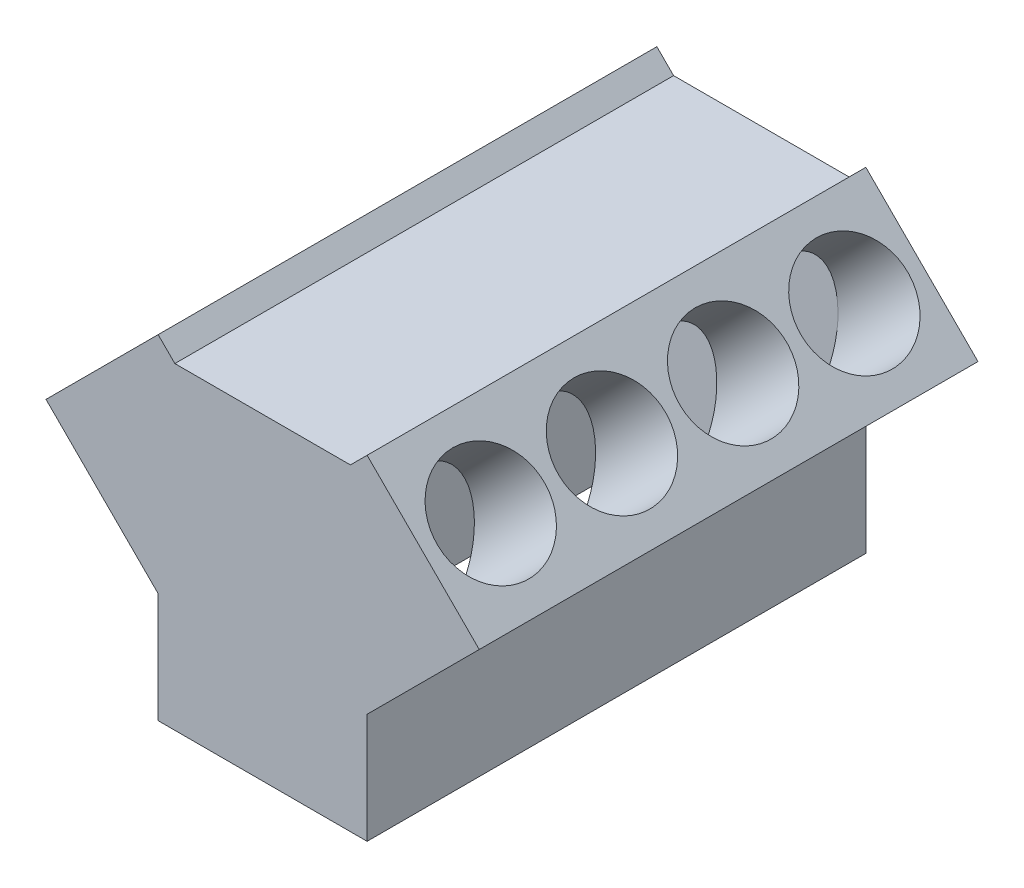
ISO-10303-21;
HEADER;
FILE_DESCRIPTION(('STEP AP214'),'2;1');
FILE_NAME('part.step','',(''),(''),'','','');
FILE_SCHEMA(('AUTOMOTIVE_DESIGN { 1 0 10303 214 1 1 1 1 }'));
ENDSEC;
DATA;
#1=APPLICATION_CONTEXT('core data for automotive mechanical design processes');
#2=APPLICATION_PROTOCOL_DEFINITION('international standard','automotive_design',2000,#1);
#3=PRODUCT_CONTEXT('',#1,'mechanical');
#4=PRODUCT('Part','Part','',(#3));
#5=PRODUCT_RELATED_PRODUCT_CATEGORY('part','',(#4));
#6=PRODUCT_DEFINITION_FORMATION('','',#4);
#7=PRODUCT_DEFINITION_CONTEXT('part definition',#1,'design');
#8=PRODUCT_DEFINITION('design','',#6,#7);
#9=PRODUCT_DEFINITION_SHAPE('','',#8);
#10=(LENGTH_UNIT() NAMED_UNIT(*) SI_UNIT(.MILLI.,.METRE.));
#11=(NAMED_UNIT(*) PLANE_ANGLE_UNIT() SI_UNIT($,.RADIAN.));
#12=(NAMED_UNIT(*) SI_UNIT($,.STERADIAN.) SOLID_ANGLE_UNIT());
#13=UNCERTAINTY_MEASURE_WITH_UNIT(LENGTH_MEASURE(1.E-05),#10,'distance_accuracy_value','');
#14=(GEOMETRIC_REPRESENTATION_CONTEXT(3) GLOBAL_UNCERTAINTY_ASSIGNED_CONTEXT((#13)) GLOBAL_UNIT_ASSIGNED_CONTEXT((#10,
#11,#12)) REPRESENTATION_CONTEXT('',''));
#15=CARTESIAN_POINT('',(0.,0.,0.));
#16=DIRECTION('',(0.,0.,1.));
#17=DIRECTION('',(1.,0.,0.));
#18=AXIS2_PLACEMENT_3D('',#15,#16,#17);
#19=CARTESIAN_POINT('',(0.,-150.,0.));
#20=DIRECTION('',(0.,-1.,0.));
#21=DIRECTION('',(0.,0.,-1.));
#22=AXIS2_PLACEMENT_3D('',#19,#20,#21);
#23=PLANE('',#22);
#24=DIRECTION('',(1.,0.,0.));
#25=VECTOR('',#24,1.);
#26=CARTESIAN_POINT('',(28.,-150.,-179.));
#27=LINE('',#26,#25);
#28=CARTESIAN_POINT('',(28.,-150.,-179.));
#29=VERTEX_POINT('',#28);
#30=CARTESIAN_POINT('',(178.,-150.,-179.));
#31=VERTEX_POINT('',#30);
#32=EDGE_CURVE('E267',#29,#31,#27,.T.);
#33=ORIENTED_EDGE('',*,*,#32,.T.);
#34=DIRECTION('',(0.,0.,1.));
#35=VECTOR('',#34,1.);
#36=CARTESIAN_POINT('',(178.,-150.,-179.));
#37=LINE('',#36,#35);
#38=CARTESIAN_POINT('',(178.,-150.,179.));
#39=VERTEX_POINT('',#38);
#40=EDGE_CURVE('E270',#31,#39,#37,.T.);
#41=ORIENTED_EDGE('',*,*,#40,.T.);
#42=DIRECTION('',(1.,0.,0.));
#43=VECTOR('',#42,1.);
#44=CARTESIAN_POINT('',(28.,-150.,179.));
#45=LINE('',#44,#43);
#46=CARTESIAN_POINT('',(28.,-150.,179.));
#47=VERTEX_POINT('',#46);
#48=EDGE_CURVE('E272',#47,#39,#45,.T.);
#49=ORIENTED_EDGE('',*,*,#48,.F.);
#50=DIRECTION('',(0.,0.,1.));
#51=VECTOR('',#50,1.);
#52=CARTESIAN_POINT('',(28.,-150.,-179.));
#53=LINE('',#52,#51);
#54=EDGE_CURVE('E275',#29,#47,#53,.T.);
#55=ORIENTED_EDGE('',*,*,#54,.F.);
#56=EDGE_LOOP('',(#33,#41,#49,#55));
#57=FACE_BOUND('',#56,.T.);
#58=DIRECTION('',(-1.,0.,0.));
#59=VECTOR('',#58,1.);
#60=CARTESIAN_POINT('',(0.,-150.,-169.));
#61=LINE('',#60,#59);
#62=CARTESIAN_POINT('',(168.,-150.,-169.));
#63=VERTEX_POINT('',#62);
#64=CARTESIAN_POINT('',(38.,-150.,-169.));
#65=VERTEX_POINT('',#64);
#66=EDGE_CURVE('E204',#63,#65,#61,.T.);
#67=ORIENTED_EDGE('',*,*,#66,.T.);
#68=DIRECTION('',(0.,0.,1.));
#69=VECTOR('',#68,1.);
#70=CARTESIAN_POINT('',(38.,-150.,0.));
#71=LINE('',#70,#69);
#72=CARTESIAN_POINT('',(38.,-150.,169.));
#73=VERTEX_POINT('',#72);
#74=EDGE_CURVE('E67',#65,#73,#71,.T.);
#75=ORIENTED_EDGE('',*,*,#74,.T.);
#76=DIRECTION('',(-1.,0.,0.));
#77=VECTOR('',#76,1.);
#78=CARTESIAN_POINT('',(0.,-150.,169.));
#79=LINE('',#78,#77);
#80=CARTESIAN_POINT('',(168.,-150.,169.));
#81=VERTEX_POINT('',#80);
#82=EDGE_CURVE('E195',#81,#73,#79,.T.);
#83=ORIENTED_EDGE('',*,*,#82,.F.);
#84=DIRECTION('',(0.,0.,1.));
#85=VECTOR('',#84,1.);
#86=CARTESIAN_POINT('',(168.,-150.,0.));
#87=LINE('',#86,#85);
#88=EDGE_CURVE('E198',#63,#81,#87,.T.);
#89=ORIENTED_EDGE('',*,*,#88,.F.);
#90=EDGE_LOOP('',(#67,#75,#83,#89));
#91=FACE_BOUND('',#90,.T.);
#92=ADVANCED_FACE('F50',(#57,#91),#23,.T.);
#93=CARTESIAN_POINT('',(69.0672798364513,-31.5672798364546,-130.637230843016));
#94=DIRECTION('',(-0.707106781186548,0.707106781186547,0.));
#95=DIRECTION('',(-0.707106781186547,-0.707106781186548,0.));
#96=AXIS2_PLACEMENT_3D('',#93,#94,#95);
#97=CYLINDRICAL_SURFACE('',#96,38.5);
#98=CARTESIAN_POINT('',(-12.2500000000017,49.7499999999984,-130.637230843016));
#99=DIRECTION('',(-0.707106781186548,0.707106781186547,0.));
#100=DIRECTION('',(-0.707106781186547,-0.707106781186548,0.));
#101=AXIS2_PLACEMENT_3D('',#98,#99,#100);
#102=CIRCLE('',#101,38.5);
#103=CARTESIAN_POINT('',(-39.4736110756838,22.5263889243163,-130.637230843016));
#104=VERTEX_POINT('',#103);
#105=EDGE_CURVE('E259',#104,#104,#102,.T.);
#106=ORIENTED_EDGE('',*,*,#105,.T.);
#107=EDGE_LOOP('',(#106));
#108=FACE_BOUND('',#107,.T.);
#109=DIRECTION('',(-0.707106781186548,0.707106781186547,0.));
#110=VECTOR('',#109,1.);
#111=CARTESIAN_POINT('',(71.3637926937989,-29.270766979107,-169.));
#112=LINE('',#111,#110);
#113=CARTESIAN_POINT('',(38.,4.09302571469193,-169.));
#114=VERTEX_POINT('',#113);
#115=CARTESIAN_POINT('',(71.3637926937989,-29.270766979107,-169.));
#116=VERTEX_POINT('',#115);
#117=EDGE_CURVE('E75',#114,#116,#112,.F.);
#118=ORIENTED_EDGE('',*,*,#117,.F.);
#119=CARTESIAN_POINT('',(38.,-0.500000000003258,-130.637230843016));
#120=DIRECTION('',(1.,0.,0.));
#121=DIRECTION('',(0.,1.,0.));
#122=AXIS2_PLACEMENT_3D('',#119,#120,#121);
#123=ELLIPSE('',#122,54.4472221513642,38.5);
#124=CARTESIAN_POINT('',(38.,-5.09302571469845,-169.));
#125=VERTEX_POINT('',#124);
#126=EDGE_CURVE('E187',#125,#114,#123,.F.);
#127=ORIENTED_EDGE('',*,*,#126,.F.);
#128=DIRECTION('',(-0.707106781186548,0.707106781186547,0.));
#129=VECTOR('',#128,1.);
#130=CARTESIAN_POINT('',(66.7707669791037,-33.8637926938022,-169.));
#131=LINE('',#130,#129);
#132=CARTESIAN_POINT('',(66.7707669791037,-33.8637926938022,-169.));
#133=VERTEX_POINT('',#132);
#134=EDGE_CURVE('E226',#133,#125,#131,.T.);
#135=ORIENTED_EDGE('',*,*,#134,.F.);
#136=CARTESIAN_POINT('',(69.0672798364513,-31.5672798364546,-130.637230843016));
#137=DIRECTION('',(-0.707106781186548,0.707106781186547,0.));
#138=DIRECTION('',(-0.707106781186547,-0.707106781186548,0.));
#139=AXIS2_PLACEMENT_3D('',#136,#137,#138);
#140=CIRCLE('',#139,38.5);
#141=EDGE_CURVE('E240',#116,#133,#140,.T.);
#142=ORIENTED_EDGE('',*,*,#141,.F.);
#143=EDGE_LOOP('',(#118,#127,#135,#142));
#144=FACE_BOUND('',#143,.T.);
#145=ADVANCED_FACE('F395',(#108,#144),#97,.F.);
#146=CARTESIAN_POINT('',(69.0672798364513,-31.5672798364546,-130.637230843016));
#147=DIRECTION('',(-0.707106781186548,0.707106781186547,0.));
#148=DIRECTION('',(-0.707106781186547,-0.707106781186548,0.));
#149=AXIS2_PLACEMENT_3D('',#146,#147,#148);
#150=PLANE('',#149);
#151=ORIENTED_EDGE('',*,*,#141,.T.);
#152=DIRECTION('',(0.707106781186547,0.707106781186548,0.));
#153=VECTOR('',#152,1.);
#154=CARTESIAN_POINT('',(69.0672798364513,-31.5672798364546,-169.));
#155=LINE('',#154,#153);
#156=EDGE_CURVE('E224',#133,#116,#155,.T.);
#157=ORIENTED_EDGE('',*,*,#156,.T.);
#158=EDGE_LOOP('',(#151,#157));
#159=FACE_BOUND('',#158,.T.);
#160=ADVANCED_FACE('F401',(#159),#150,.T.);
#161=CARTESIAN_POINT('',(69.0672798364517,-31.5672798364541,-43.6372308430156));
#162=DIRECTION('',(-0.707106781186548,0.707106781186547,0.));
#163=DIRECTION('',(-0.707106781186547,-0.707106781186548,0.));
#164=AXIS2_PLACEMENT_3D('',#161,#162,#163);
#165=CYLINDRICAL_SURFACE('',#164,38.5);
#166=CARTESIAN_POINT('',(-12.2500000000013,49.7499999999988,-43.6372308430156));
#167=DIRECTION('',(-0.707106781186548,0.707106781186547,0.));
#168=DIRECTION('',(-0.707106781186547,-0.707106781186548,0.));
#169=AXIS2_PLACEMENT_3D('',#166,#167,#168);
#170=CIRCLE('',#169,38.5);
#171=CARTESIAN_POINT('',(-39.4736110756833,22.5263889243167,-43.6372308430156));
#172=VERTEX_POINT('',#171);
#173=EDGE_CURVE('E256',#172,#172,#170,.T.);
#174=ORIENTED_EDGE('',*,*,#173,.T.);
#175=EDGE_LOOP('',(#174));
#176=FACE_BOUND('',#175,.T.);
#177=CARTESIAN_POINT('',(38.,-0.500000000002394,-43.6372308430156));
#178=DIRECTION('',(1.,0.,0.));
#179=DIRECTION('',(0.,1.,0.));
#180=AXIS2_PLACEMENT_3D('',#177,#178,#179);
#181=ELLIPSE('',#180,54.4472221513642,38.5);
#182=CARTESIAN_POINT('',(38.,53.9472221513618,-43.6372308430156));
#183=VERTEX_POINT('',#182);
#184=EDGE_CURVE('E232',#183,#183,#181,.F.);
#185=ORIENTED_EDGE('',*,*,#184,.F.);
#186=EDGE_LOOP('',(#185));
#187=FACE_BOUND('',#186,.T.);
#188=ADVANCED_FACE('F443',(#176,#187),#165,.F.);
#189=CARTESIAN_POINT('',(69.0672798364522,-31.5672798364537,43.3627691569844));
#190=DIRECTION('',(-0.707106781186548,0.707106781186547,0.));
#191=DIRECTION('',(-0.707106781186547,-0.707106781186548,0.));
#192=AXIS2_PLACEMENT_3D('',#189,#190,#191);
#193=CYLINDRICAL_SURFACE('',#192,38.5);
#194=CARTESIAN_POINT('',(-12.2500000000008,49.7499999999993,43.3627691569844));
#195=DIRECTION('',(-0.707106781186548,0.707106781186547,0.));
#196=DIRECTION('',(-0.707106781186547,-0.707106781186548,0.));
#197=AXIS2_PLACEMENT_3D('',#194,#195,#196);
#198=CIRCLE('',#197,38.5);
#199=CARTESIAN_POINT('',(-39.4736110756829,22.5263889243172,43.3627691569844));
#200=VERTEX_POINT('',#199);
#201=EDGE_CURVE('E253',#200,#200,#198,.T.);
#202=ORIENTED_EDGE('',*,*,#201,.T.);
#203=EDGE_LOOP('',(#202));
#204=FACE_BOUND('',#203,.T.);
#205=CARTESIAN_POINT('',(38.,-0.500000000001534,43.3627691569844));
#206=DIRECTION('',(1.,0.,0.));
#207=DIRECTION('',(0.,1.,0.));
#208=AXIS2_PLACEMENT_3D('',#205,#206,#207);
#209=ELLIPSE('',#208,54.4472221513642,38.5);
#210=CARTESIAN_POINT('',(38.,53.9472221513626,43.3627691569844));
#211=VERTEX_POINT('',#210);
#212=EDGE_CURVE('E229',#211,#211,#209,.F.);
#213=ORIENTED_EDGE('',*,*,#212,.F.);
#214=EDGE_LOOP('',(#213));
#215=FACE_BOUND('',#214,.T.);
#216=ADVANCED_FACE('F439',(#204,#215),#193,.F.);
#217=CARTESIAN_POINT('',(69.0672798364526,-31.5672798364533,130.362769156984));
#218=DIRECTION('',(-0.707106781186548,0.707106781186547,0.));
#219=DIRECTION('',(-0.707106781186547,-0.707106781186548,0.));
#220=AXIS2_PLACEMENT_3D('',#217,#218,#219);
#221=CYLINDRICAL_SURFACE('',#220,38.5);
#222=CARTESIAN_POINT('',(-12.2500000000004,49.7499999999997,130.362769156984));
#223=DIRECTION('',(-0.707106781186548,0.707106781186547,0.));
#224=DIRECTION('',(-0.707106781186547,-0.707106781186548,0.));
#225=AXIS2_PLACEMENT_3D('',#222,#223,#224);
#226=CIRCLE('',#225,38.5);
#227=CARTESIAN_POINT('',(-39.4736110756825,22.5263889243176,130.362769156984));
#228=VERTEX_POINT('',#227);
#229=EDGE_CURVE('E249',#228,#228,#226,.T.);
#230=ORIENTED_EDGE('',*,*,#229,.T.);
#231=EDGE_LOOP('',(#230));
#232=FACE_BOUND('',#231,.T.);
#233=CARTESIAN_POINT('',(38.,-0.500000000000673,130.362769156984));
#234=DIRECTION('',(1.,0.,0.));
#235=DIRECTION('',(0.,1.,0.));
#236=AXIS2_PLACEMENT_3D('',#233,#234,#235);
#237=ELLIPSE('',#236,54.4472221513642,38.5);
#238=CARTESIAN_POINT('',(38.,53.9472221513635,130.362769156984));
#239=VERTEX_POINT('',#238);
#240=EDGE_CURVE('E55',#239,#239,#237,.F.);
#241=ORIENTED_EDGE('',*,*,#240,.F.);
#242=EDGE_LOOP('',(#241));
#243=FACE_BOUND('',#242,.T.);
#244=ADVANCED_FACE('F391',(#232,#243),#221,.F.);
#245=CARTESIAN_POINT('',(-50.,12.0000000000001,179.));
#246=DIRECTION('',(0.707106781186548,-0.707106781186548,0.));
#247=DIRECTION('',(0.,0.,-1.));
#248=AXIS2_PLACEMENT_3D('',#245,#246,#247);
#249=PLANE('',#248);
#250=ORIENTED_EDGE('',*,*,#229,.F.);
#251=EDGE_LOOP('',(#250));
#252=FACE_BOUND('',#251,.T.);
#253=ORIENTED_EDGE('',*,*,#201,.F.);
#254=EDGE_LOOP('',(#253));
#255=FACE_BOUND('',#254,.T.);
#256=ORIENTED_EDGE('',*,*,#173,.F.);
#257=EDGE_LOOP('',(#256));
#258=FACE_BOUND('',#257,.T.);
#259=ORIENTED_EDGE('',*,*,#105,.F.);
#260=EDGE_LOOP('',(#259));
#261=FACE_BOUND('',#260,.T.);
#262=DIRECTION('',(-0.707106781186548,-0.707106781186548,0.));
#263=VECTOR('',#262,1.);
#264=CARTESIAN_POINT('',(-50.,12.0000000000001,-179.));
#265=LINE('',#264,#263);
#266=CARTESIAN_POINT('',(-52.5000000000008,9.49999999999929,-179.));
#267=VERTEX_POINT('',#266);
#268=CARTESIAN_POINT('',(28.,90.0000000000001,-179.));
#269=VERTEX_POINT('',#268);
#270=EDGE_CURVE('E303',#267,#269,#265,.F.);
#271=ORIENTED_EDGE('',*,*,#270,.F.);
#272=DIRECTION('',(0.,0.,1.));
#273=VECTOR('',#272,1.);
#274=CARTESIAN_POINT('',(-52.5000000000008,9.49999999999929,0.));
#275=LINE('',#274,#273);
#276=CARTESIAN_POINT('',(-52.5000000000008,9.49999999999929,179.));
#277=VERTEX_POINT('',#276);
#278=EDGE_CURVE('E320',#267,#277,#275,.T.);
#279=ORIENTED_EDGE('',*,*,#278,.T.);
#280=DIRECTION('',(0.707106781186548,0.707106781186548,0.));
#281=VECTOR('',#280,1.);
#282=CARTESIAN_POINT('',(-50.,12.0000000000001,179.));
#283=LINE('',#282,#281);
#284=CARTESIAN_POINT('',(28.,90.0000000000001,179.));
#285=VERTEX_POINT('',#284);
#286=EDGE_CURVE('E301',#285,#277,#283,.F.);
#287=ORIENTED_EDGE('',*,*,#286,.F.);
#288=DIRECTION('',(0.,0.,1.));
#289=VECTOR('',#288,1.);
#290=CARTESIAN_POINT('',(28.,90.0000000000001,0.));
#291=LINE('',#290,#289);
#292=EDGE_CURVE('E298',#269,#285,#291,.T.);
#293=ORIENTED_EDGE('',*,*,#292,.F.);
#294=EDGE_LOOP('',(#271,#279,#287,#293));
#295=FACE_BOUND('',#294,.T.);
#296=ADVANCED_FACE('F352',(#252,#255,#258,#261,#295),#249,.F.);
#297=CARTESIAN_POINT('',(-50.,90.0000000000001,-179.));
#298=DIRECTION('',(0.,0.,1.));
#299=DIRECTION('',(1.,0.,0.));
#300=AXIS2_PLACEMENT_3D('',#297,#298,#299);
#301=PLANE('',#300);
#302=DIRECTION('',(-1.,0.,0.));
#303=VECTOR('',#302,1.);
#304=CARTESIAN_POINT('',(41.,78.0000000000001,-179.));
#305=LINE('',#304,#303);
#306=CARTESIAN_POINT('',(166.,78.0000000000001,-179.));
#307=VERTEX_POINT('',#306);
#308=CARTESIAN_POINT('',(39.9999999999998,78.0000000000001,-179.));
#309=VERTEX_POINT('',#308);
#310=EDGE_CURVE('E252',#307,#309,#305,.T.);
#311=ORIENTED_EDGE('',*,*,#310,.F.);
#312=DIRECTION('',(-0.707106781186544,-0.707106781186551,0.));
#313=VECTOR('',#312,1.);
#314=CARTESIAN_POINT('',(165.,76.9999999999998,-179.));
#315=LINE('',#314,#313);
#316=CARTESIAN_POINT('',(178.,90.0000000000001,-179.));
#317=VERTEX_POINT('',#316);
#318=EDGE_CURVE('E331',#307,#317,#315,.F.);
#319=ORIENTED_EDGE('',*,*,#318,.T.);
#320=DIRECTION('',(0.707106781186548,-0.707106781186548,0.));
#321=VECTOR('',#320,1.);
#322=CARTESIAN_POINT('',(256.,12.0000000000001,-179.));
#323=LINE('',#322,#321);
#324=CARTESIAN_POINT('',(258.500000000001,9.49999999999932,-179.));
#325=VERTEX_POINT('',#324);
#326=EDGE_CURVE('E295',#325,#317,#323,.F.);
#327=ORIENTED_EDGE('',*,*,#326,.F.);
#328=DIRECTION('',(0.707106781186551,0.707106781186544,0.));
#329=VECTOR('',#328,1.);
#330=CARTESIAN_POINT('',(144.499999999999,-104.500000000001,-179.));
#331=LINE('',#330,#329);
#332=CARTESIAN_POINT('',(178.,-71.0000000000006,-179.));
#333=VERTEX_POINT('',#332);
#334=EDGE_CURVE('E315',#325,#333,#331,.F.);
#335=ORIENTED_EDGE('',*,*,#334,.T.);
#336=DIRECTION('',(0.,1.,0.));
#337=VECTOR('',#336,1.);
#338=CARTESIAN_POINT('',(178.,-150.,-179.));
#339=LINE('',#338,#337);
#340=EDGE_CURVE('E287',#31,#333,#339,.T.);
#341=ORIENTED_EDGE('',*,*,#340,.F.);
#342=ORIENTED_EDGE('',*,*,#32,.F.);
#343=DIRECTION('',(0.,1.,0.));
#344=VECTOR('',#343,1.);
#345=CARTESIAN_POINT('',(28.,-150.,-179.));
#346=LINE('',#345,#344);
#347=CARTESIAN_POINT('',(28.,-71.0000000000006,-179.));
#348=VERTEX_POINT('',#347);
#349=EDGE_CURVE('E278',#29,#348,#346,.T.);
#350=ORIENTED_EDGE('',*,*,#349,.T.);
#351=DIRECTION('',(0.707106781186551,-0.707106781186544,0.));
#352=VECTOR('',#351,1.);
#353=CARTESIAN_POINT('',(-91.5000000000008,48.4999999999989,-179.));
#354=LINE('',#353,#352);
#355=EDGE_CURVE('E325',#348,#267,#354,.F.);
#356=ORIENTED_EDGE('',*,*,#355,.T.);
#357=ORIENTED_EDGE('',*,*,#270,.T.);
#358=DIRECTION('',(-0.707106781186544,0.707106781186551,0.));
#359=VECTOR('',#358,1.);
#360=CARTESIAN_POINT('',(41.,76.9999999999998,-179.));
#361=LINE('',#360,#359);
#362=EDGE_CURVE('E328',#269,#309,#361,.F.);
#363=ORIENTED_EDGE('',*,*,#362,.T.);
#364=EDGE_LOOP('',(#311,#319,#327,#335,#341,#342,#350,#356,#357,#363));
#365=FACE_BOUND('',#364,.T.);
#366=ADVANCED_FACE('F383',(#365),#301,.F.);
#367=CARTESIAN_POINT('',(-50.,90.0000000000001,179.));
#368=DIRECTION('',(0.,0.,-1.));
#369=DIRECTION('',(-1.,0.,0.));
#370=AXIS2_PLACEMENT_3D('',#367,#368,#369);
#371=PLANE('',#370);
#372=DIRECTION('',(0.707106781186544,0.707106781186551,0.));
#373=VECTOR('',#372,1.);
#374=CARTESIAN_POINT('',(165.,76.9999999999998,179.));
#375=LINE('',#374,#373);
#376=CARTESIAN_POINT('',(178.,90.0000000000001,179.));
#377=VERTEX_POINT('',#376);
#378=CARTESIAN_POINT('',(166.,78.0000000000001,179.));
#379=VERTEX_POINT('',#378);
#380=EDGE_CURVE('E335',#377,#379,#375,.F.);
#381=ORIENTED_EDGE('',*,*,#380,.T.);
#382=DIRECTION('',(1.,0.,0.));
#383=VECTOR('',#382,1.);
#384=CARTESIAN_POINT('',(41.,78.0000000000001,179.));
#385=LINE('',#384,#383);
#386=CARTESIAN_POINT('',(39.9999999999998,78.0000000000001,179.));
#387=VERTEX_POINT('',#386);
#388=EDGE_CURVE('E265',#387,#379,#385,.T.);
#389=ORIENTED_EDGE('',*,*,#388,.F.);
#390=DIRECTION('',(0.707106781186544,-0.707106781186551,0.));
#391=VECTOR('',#390,1.);
#392=CARTESIAN_POINT('',(41.,76.9999999999998,179.));
#393=LINE('',#392,#391);
#394=EDGE_CURVE('E333',#387,#285,#393,.F.);
#395=ORIENTED_EDGE('',*,*,#394,.T.);
#396=ORIENTED_EDGE('',*,*,#286,.T.);
#397=DIRECTION('',(-0.707106781186551,0.707106781186544,0.));
#398=VECTOR('',#397,1.);
#399=CARTESIAN_POINT('',(-91.5000000000008,48.4999999999989,179.));
#400=LINE('',#399,#398);
#401=CARTESIAN_POINT('',(28.,-71.0000000000006,179.));
#402=VERTEX_POINT('',#401);
#403=EDGE_CURVE('E323',#277,#402,#400,.F.);
#404=ORIENTED_EDGE('',*,*,#403,.T.);
#405=DIRECTION('',(0.,1.,0.));
#406=VECTOR('',#405,1.);
#407=CARTESIAN_POINT('',(28.,-150.,179.));
#408=LINE('',#407,#406);
#409=EDGE_CURVE('E281',#47,#402,#408,.T.);
#410=ORIENTED_EDGE('',*,*,#409,.F.);
#411=ORIENTED_EDGE('',*,*,#48,.T.);
#412=DIRECTION('',(0.,1.,0.));
#413=VECTOR('',#412,1.);
#414=CARTESIAN_POINT('',(178.,-150.,179.));
#415=LINE('',#414,#413);
#416=CARTESIAN_POINT('',(178.,-71.0000000000006,179.));
#417=VERTEX_POINT('',#416);
#418=EDGE_CURVE('E284',#39,#417,#415,.T.);
#419=ORIENTED_EDGE('',*,*,#418,.T.);
#420=DIRECTION('',(-0.707106781186551,-0.707106781186544,0.));
#421=VECTOR('',#420,1.);
#422=CARTESIAN_POINT('',(144.499999999999,-104.500000000001,179.));
#423=LINE('',#422,#421);
#424=CARTESIAN_POINT('',(258.500000000001,9.49999999999932,179.));
#425=VERTEX_POINT('',#424);
#426=EDGE_CURVE('E317',#417,#425,#423,.F.);
#427=ORIENTED_EDGE('',*,*,#426,.T.);
#428=DIRECTION('',(-0.707106781186548,0.707106781186548,0.));
#429=VECTOR('',#428,1.);
#430=CARTESIAN_POINT('',(256.,12.0000000000001,179.));
#431=LINE('',#430,#429);
#432=EDGE_CURVE('E293',#377,#425,#431,.F.);
#433=ORIENTED_EDGE('',*,*,#432,.F.);
#434=EDGE_LOOP('',(#381,#389,#395,#396,#404,#410,#411,#419,#427,#433));
#435=FACE_BOUND('',#434,.T.);
#436=ADVANCED_FACE('F350',(#435),#371,.F.);
#437=CARTESIAN_POINT('',(256.,12.0000000000001,179.));
#438=DIRECTION('',(-0.707106781186548,-0.707106781186548,0.));
#439=DIRECTION('',(0.,0.,-1.));
#440=AXIS2_PLACEMENT_3D('',#437,#438,#439);
#441=PLANE('',#440);
#442=CARTESIAN_POINT('',(218.25,49.7499999999997,130.5));
#443=DIRECTION('',(0.707106781186548,0.707106781186547,0.));
#444=DIRECTION('',(-0.707106781186547,0.707106781186548,0.));
#445=AXIS2_PLACEMENT_3D('',#442,#443,#444);
#446=CIRCLE('',#445,38.5);
#447=CARTESIAN_POINT('',(191.026388924318,76.9736110756818,130.5));
#448=VERTEX_POINT('',#447);
#449=EDGE_CURVE('E237',#448,#448,#446,.T.);
#450=ORIENTED_EDGE('',*,*,#449,.F.);
#451=EDGE_LOOP('',(#450));
#452=FACE_BOUND('',#451,.T.);
#453=CARTESIAN_POINT('',(218.25,49.7499999999997,43.5));
#454=DIRECTION('',(0.707106781186548,0.707106781186547,0.));
#455=DIRECTION('',(-0.707106781186547,0.707106781186548,0.));
#456=AXIS2_PLACEMENT_3D('',#453,#454,#455);
#457=CIRCLE('',#456,38.5);
#458=CARTESIAN_POINT('',(191.026388924318,76.9736110756818,43.5));
#459=VERTEX_POINT('',#458);
#460=EDGE_CURVE('E241',#459,#459,#457,.T.);
#461=ORIENTED_EDGE('',*,*,#460,.F.);
#462=EDGE_LOOP('',(#461));
#463=FACE_BOUND('',#462,.T.);
#464=CARTESIAN_POINT('',(218.25,49.7499999999997,-43.5));
#465=DIRECTION('',(0.707106781186548,0.707106781186547,0.));
#466=DIRECTION('',(-0.707106781186547,0.707106781186548,0.));
#467=AXIS2_PLACEMENT_3D('',#464,#465,#466);
#468=CIRCLE('',#467,38.5);
#469=CARTESIAN_POINT('',(191.026388924318,76.9736110756818,-43.5));
#470=VERTEX_POINT('',#469);
#471=EDGE_CURVE('E244',#470,#470,#468,.T.);
#472=ORIENTED_EDGE('',*,*,#471,.F.);
#473=EDGE_LOOP('',(#472));
#474=FACE_BOUND('',#473,.T.);
#475=CARTESIAN_POINT('',(218.25,49.7499999999997,-130.5));
#476=DIRECTION('',(0.707106781186548,0.707106781186547,0.));
#477=DIRECTION('',(-0.707106781186547,0.707106781186548,0.));
#478=AXIS2_PLACEMENT_3D('',#475,#476,#477);
#479=CIRCLE('',#478,38.5);
#480=CARTESIAN_POINT('',(191.026388924318,76.9736110756818,-130.5));
#481=VERTEX_POINT('',#480);
#482=EDGE_CURVE('E236',#481,#481,#479,.T.);
#483=ORIENTED_EDGE('',*,*,#482,.F.);
#484=EDGE_LOOP('',(#483));
#485=FACE_BOUND('',#484,.T.);
#486=ORIENTED_EDGE('',*,*,#432,.T.);
#487=DIRECTION('',(0.,0.,-1.));
#488=VECTOR('',#487,1.);
#489=CARTESIAN_POINT('',(258.500000000001,9.49999999999932,0.));
#490=LINE('',#489,#488);
#491=EDGE_CURVE('E312',#425,#325,#490,.T.);
#492=ORIENTED_EDGE('',*,*,#491,.T.);
#493=ORIENTED_EDGE('',*,*,#326,.T.);
#494=DIRECTION('',(0.,0.,1.));
#495=VECTOR('',#494,1.);
#496=CARTESIAN_POINT('',(178.,90.0000000000001,0.));
#497=LINE('',#496,#495);
#498=EDGE_CURVE('E290',#317,#377,#497,.T.);
#499=ORIENTED_EDGE('',*,*,#498,.T.);
#500=EDGE_LOOP('',(#486,#492,#493,#499));
#501=FACE_BOUND('',#500,.T.);
#502=ADVANCED_FACE('F376',(#452,#463,#474,#485,#501),#441,.F.);
#503=CARTESIAN_POINT('',(178.,-150.,-179.));
#504=DIRECTION('',(-1.,0.,0.));
#505=DIRECTION('',(0.,0.,1.));
#506=AXIS2_PLACEMENT_3D('',#503,#504,#505);
#507=PLANE('',#506);
#508=ORIENTED_EDGE('',*,*,#340,.T.);
#509=DIRECTION('',(0.,0.,1.));
#510=VECTOR('',#509,1.);
#511=CARTESIAN_POINT('',(178.,-71.0000000000006,179.));
#512=LINE('',#511,#510);
#513=EDGE_CURVE('E306',#333,#417,#512,.T.);
#514=ORIENTED_EDGE('',*,*,#513,.T.);
#515=ORIENTED_EDGE('',*,*,#418,.F.);
#516=ORIENTED_EDGE('',*,*,#40,.F.);
#517=EDGE_LOOP('',(#508,#514,#515,#516));
#518=FACE_BOUND('',#517,.T.);
#519=ADVANCED_FACE('F370',(#518),#507,.F.);
#520=CARTESIAN_POINT('',(28.,-150.,-179.));
#521=DIRECTION('',(-1.,0.,0.));
#522=DIRECTION('',(0.,0.,1.));
#523=AXIS2_PLACEMENT_3D('',#520,#521,#522);
#524=PLANE('',#523);
#525=ORIENTED_EDGE('',*,*,#409,.T.);
#526=DIRECTION('',(0.,0.,-1.));
#527=VECTOR('',#526,1.);
#528=CARTESIAN_POINT('',(28.,-71.0000000000006,-179.));
#529=LINE('',#528,#527);
#530=EDGE_CURVE('E309',#402,#348,#529,.T.);
#531=ORIENTED_EDGE('',*,*,#530,.T.);
#532=ORIENTED_EDGE('',*,*,#349,.F.);
#533=ORIENTED_EDGE('',*,*,#54,.T.);
#534=EDGE_LOOP('',(#525,#531,#532,#533));
#535=FACE_BOUND('',#534,.T.);
#536=ADVANCED_FACE('F360',(#535),#524,.T.);
#537=CARTESIAN_POINT('',(261.000000000001,12.,0.));
#538=DIRECTION('',(0.707106781186544,-0.707106781186551,0.));
#539=DIRECTION('',(0.,0.,1.));
#540=AXIS2_PLACEMENT_3D('',#537,#538,#539);
#541=PLANE('',#540);
#542=ORIENTED_EDGE('',*,*,#426,.F.);
#543=ORIENTED_EDGE('',*,*,#513,.F.);
#544=ORIENTED_EDGE('',*,*,#334,.F.);
#545=ORIENTED_EDGE('',*,*,#491,.F.);
#546=EDGE_LOOP('',(#542,#543,#544,#545));
#547=FACE_BOUND('',#546,.T.);
#548=ADVANCED_FACE('F374',(#547),#541,.T.);
#549=CARTESIAN_POINT('',(-55.0000000000015,12.,0.));
#550=DIRECTION('',(-0.707106781186544,-0.707106781186551,0.));
#551=DIRECTION('',(0.,0.,-1.));
#552=AXIS2_PLACEMENT_3D('',#549,#550,#551);
#553=PLANE('',#552);
#554=ORIENTED_EDGE('',*,*,#355,.F.);
#555=ORIENTED_EDGE('',*,*,#530,.F.);
#556=ORIENTED_EDGE('',*,*,#403,.F.);
#557=ORIENTED_EDGE('',*,*,#278,.F.);
#558=EDGE_LOOP('',(#554,#555,#556,#557));
#559=FACE_BOUND('',#558,.T.);
#560=ADVANCED_FACE('F357',(#559),#553,.T.);
#561=CARTESIAN_POINT('',(0.,78.0000000000001,0.));
#562=DIRECTION('',(0.,-1.,0.));
#563=DIRECTION('',(0.,0.,-1.));
#564=AXIS2_PLACEMENT_3D('',#561,#562,#563);
#565=PLANE('',#564);
#566=ORIENTED_EDGE('',*,*,#388,.T.);
#567=DIRECTION('',(0.,0.,1.));
#568=VECTOR('',#567,1.);
#569=CARTESIAN_POINT('',(166.,78.0000000000001,0.));
#570=LINE('',#569,#568);
#571=EDGE_CURVE('E338',#379,#307,#570,.F.);
#572=ORIENTED_EDGE('',*,*,#571,.T.);
#573=ORIENTED_EDGE('',*,*,#310,.T.);
#574=DIRECTION('',(0.,0.,-1.));
#575=VECTOR('',#574,1.);
#576=CARTESIAN_POINT('',(39.9999999999998,78.0000000000001,0.));
#577=LINE('',#576,#575);
#578=EDGE_CURVE('E60',#309,#387,#577,.F.);
#579=ORIENTED_EDGE('',*,*,#578,.T.);
#580=EDGE_LOOP('',(#566,#572,#573,#579));
#581=FACE_BOUND('',#580,.T.);
#582=ADVANCED_FACE('F345',(#581),#565,.F.);
#583=CARTESIAN_POINT('',(165.,76.9999999999998,179.));
#584=DIRECTION('',(0.707106781186551,-0.707106781186544,0.));
#585=DIRECTION('',(0.,0.,-1.));
#586=AXIS2_PLACEMENT_3D('',#583,#584,#585);
#587=PLANE('',#586);
#588=ORIENTED_EDGE('',*,*,#380,.F.);
#589=ORIENTED_EDGE('',*,*,#498,.F.);
#590=ORIENTED_EDGE('',*,*,#318,.F.);
#591=ORIENTED_EDGE('',*,*,#571,.F.);
#592=EDGE_LOOP('',(#588,#589,#590,#591));
#593=FACE_BOUND('',#592,.T.);
#594=ADVANCED_FACE('F381',(#593),#587,.F.);
#595=CARTESIAN_POINT('',(41.,76.9999999999998,179.));
#596=DIRECTION('',(-0.707106781186551,-0.707106781186544,0.));
#597=DIRECTION('',(0.,0.,1.));
#598=AXIS2_PLACEMENT_3D('',#595,#596,#597);
#599=PLANE('',#598);
#600=ORIENTED_EDGE('',*,*,#362,.F.);
#601=ORIENTED_EDGE('',*,*,#292,.T.);
#602=ORIENTED_EDGE('',*,*,#394,.F.);
#603=ORIENTED_EDGE('',*,*,#578,.F.);
#604=EDGE_LOOP('',(#600,#601,#602,#603));
#605=FACE_BOUND('',#604,.T.);
#606=ADVANCED_FACE('F53',(#605),#599,.F.);
#607=CARTESIAN_POINT('',(136.932720163547,-31.5672798364532,-130.5));
#608=DIRECTION('',(0.707106781186548,0.707106781186547,0.));
#609=DIRECTION('',(-0.707106781186547,0.707106781186548,0.));
#610=AXIS2_PLACEMENT_3D('',#607,#608,#609);
#611=CYLINDRICAL_SURFACE('',#610,38.5);
#612=CARTESIAN_POINT('',(168.,-0.50000000000067,-130.5));
#613=DIRECTION('',(1.,0.,0.));
#614=DIRECTION('',(0.,1.,0.));
#615=AXIS2_PLACEMENT_3D('',#612,#613,#614);
#616=ELLIPSE('',#615,54.4472221513642,38.5);
#617=CARTESIAN_POINT('',(168.,-0.500000000000677,-169.));
#618=VERTEX_POINT('',#617);
#619=EDGE_CURVE('E221',#618,#618,#616,.F.);
#620=ORIENTED_EDGE('',*,*,#619,.T.);
#621=EDGE_LOOP('',(#620));
#622=FACE_BOUND('',#621,.T.);
#623=ORIENTED_EDGE('',*,*,#482,.T.);
#624=EDGE_LOOP('',(#623));
#625=FACE_BOUND('',#624,.T.);
#626=ADVANCED_FACE('F423',(#622,#625),#611,.F.);
#627=CARTESIAN_POINT('',(136.932720163547,-31.5672798364532,-43.5));
#628=DIRECTION('',(0.707106781186548,0.707106781186547,0.));
#629=DIRECTION('',(-0.707106781186547,0.707106781186548,0.));
#630=AXIS2_PLACEMENT_3D('',#627,#628,#629);
#631=CYLINDRICAL_SURFACE('',#630,38.5);
#632=CARTESIAN_POINT('',(168.,-0.50000000000067,-43.5));
#633=DIRECTION('',(1.,0.,0.));
#634=DIRECTION('',(0.,1.,0.));
#635=AXIS2_PLACEMENT_3D('',#632,#633,#634);
#636=ELLIPSE('',#635,54.4472221513642,38.5);
#637=CARTESIAN_POINT('',(168.,53.9472221513635,-43.5));
#638=VERTEX_POINT('',#637);
#639=EDGE_CURVE('E218',#638,#638,#636,.F.);
#640=ORIENTED_EDGE('',*,*,#639,.T.);
#641=EDGE_LOOP('',(#640));
#642=FACE_BOUND('',#641,.T.);
#643=ORIENTED_EDGE('',*,*,#471,.T.);
#644=EDGE_LOOP('',(#643));
#645=FACE_BOUND('',#644,.T.);
#646=ADVANCED_FACE('F425',(#642,#645),#631,.F.);
#647=CARTESIAN_POINT('',(136.932720163547,-31.5672798364532,43.5));
#648=DIRECTION('',(0.707106781186548,0.707106781186547,0.));
#649=DIRECTION('',(-0.707106781186547,0.707106781186548,0.));
#650=AXIS2_PLACEMENT_3D('',#647,#648,#649);
#651=CYLINDRICAL_SURFACE('',#650,38.5);
#652=CARTESIAN_POINT('',(168.,-0.50000000000067,43.5));
#653=DIRECTION('',(1.,0.,0.));
#654=DIRECTION('',(0.,1.,0.));
#655=AXIS2_PLACEMENT_3D('',#652,#653,#654);
#656=ELLIPSE('',#655,54.4472221513642,38.5);
#657=CARTESIAN_POINT('',(168.,53.9472221513635,43.5));
#658=VERTEX_POINT('',#657);
#659=EDGE_CURVE('E211',#658,#658,#656,.F.);
#660=ORIENTED_EDGE('',*,*,#659,.T.);
#661=EDGE_LOOP('',(#660));
#662=FACE_BOUND('',#661,.T.);
#663=ORIENTED_EDGE('',*,*,#460,.T.);
#664=EDGE_LOOP('',(#663));
#665=FACE_BOUND('',#664,.T.);
#666=ADVANCED_FACE('F432',(#662,#665),#651,.F.);
#667=CARTESIAN_POINT('',(136.932720163547,-31.5672798364532,130.5));
#668=DIRECTION('',(0.707106781186548,0.707106781186547,0.));
#669=DIRECTION('',(-0.707106781186547,0.707106781186548,0.));
#670=AXIS2_PLACEMENT_3D('',#667,#668,#669);
#671=CYLINDRICAL_SURFACE('',#670,38.5);
#672=CARTESIAN_POINT('',(168.,-0.50000000000067,130.5));
#673=DIRECTION('',(1.,0.,0.));
#674=DIRECTION('',(0.,1.,0.));
#675=AXIS2_PLACEMENT_3D('',#672,#673,#674);
#676=ELLIPSE('',#675,54.4472221513642,38.5);
#677=CARTESIAN_POINT('',(168.,-0.50000000000067,169.));
#678=VERTEX_POINT('',#677);
#679=EDGE_CURVE('E13',#678,#678,#676,.F.);
#680=ORIENTED_EDGE('',*,*,#679,.T.);
#681=EDGE_LOOP('',(#680));
#682=FACE_BOUND('',#681,.T.);
#683=ORIENTED_EDGE('',*,*,#449,.T.);
#684=EDGE_LOOP('',(#683));
#685=FACE_BOUND('',#684,.T.);
#686=ADVANCED_FACE('F478',(#682,#685),#671,.F.);
#687=CARTESIAN_POINT('',(38.,60.0000000000001,0.));
#688=DIRECTION('',(1.,0.,0.));
#689=DIRECTION('',(0.,0.,-1.));
#690=AXIS2_PLACEMENT_3D('',#687,#688,#689);
#691=PLANE('',#690);
#692=ORIENTED_EDGE('',*,*,#184,.T.);
#693=EDGE_LOOP('',(#692));
#694=FACE_BOUND('',#693,.T.);
#695=ORIENTED_EDGE('',*,*,#212,.T.);
#696=EDGE_LOOP('',(#695));
#697=FACE_BOUND('',#696,.T.);
#698=ORIENTED_EDGE('',*,*,#240,.T.);
#699=EDGE_LOOP('',(#698));
#700=FACE_BOUND('',#699,.T.);
#701=ORIENTED_EDGE('',*,*,#126,.T.);
#702=DIRECTION('',(0.,-1.,0.));
#703=VECTOR('',#702,1.);
#704=CARTESIAN_POINT('',(38.,60.0000000000001,-169.));
#705=LINE('',#704,#703);
#706=CARTESIAN_POINT('',(38.,60.0000000000001,-169.));
#707=VERTEX_POINT('',#706);
#708=EDGE_CURVE('E174',#707,#114,#705,.T.);
#709=ORIENTED_EDGE('',*,*,#708,.F.);
#710=DIRECTION('',(0.,0.,1.));
#711=VECTOR('',#710,1.);
#712=CARTESIAN_POINT('',(38.,60.0000000000001,0.));
#713=LINE('',#712,#711);
#714=CARTESIAN_POINT('',(38.,60.0000000000001,169.));
#715=VERTEX_POINT('',#714);
#716=EDGE_CURVE('E182',#707,#715,#713,.T.);
#717=ORIENTED_EDGE('',*,*,#716,.T.);
#718=DIRECTION('',(0.,-1.,0.));
#719=VECTOR('',#718,1.);
#720=CARTESIAN_POINT('',(38.,60.0000000000001,169.));
#721=LINE('',#720,#719);
#722=EDGE_CURVE('E209',#715,#73,#721,.T.);
#723=ORIENTED_EDGE('',*,*,#722,.T.);
#724=ORIENTED_EDGE('',*,*,#74,.F.);
#725=EDGE_CURVE('E189',#125,#65,#705,.T.);
#726=ORIENTED_EDGE('',*,*,#725,.F.);
#727=EDGE_LOOP('',(#701,#709,#717,#723,#724,#726));
#728=FACE_BOUND('',#727,.T.);
#729=ADVANCED_FACE('F184',(#694,#697,#700,#728),#691,.T.);
#730=CARTESIAN_POINT('',(0.,60.0000000000001,-169.));
#731=DIRECTION('',(0.,0.,1.));
#732=DIRECTION('',(1.,0.,0.));
#733=AXIS2_PLACEMENT_3D('',#730,#731,#732);
#734=PLANE('',#733);
#735=ORIENTED_EDGE('',*,*,#117,.T.);
#736=ORIENTED_EDGE('',*,*,#156,.F.);
#737=ORIENTED_EDGE('',*,*,#134,.T.);
#738=ORIENTED_EDGE('',*,*,#725,.T.);
#739=ORIENTED_EDGE('',*,*,#66,.F.);
#740=DIRECTION('',(0.,-1.,0.));
#741=VECTOR('',#740,1.);
#742=CARTESIAN_POINT('',(168.,60.0000000000001,-169.));
#743=LINE('',#742,#741);
#744=EDGE_CURVE('E188',#618,#63,#743,.T.);
#745=ORIENTED_EDGE('',*,*,#744,.F.);
#746=CARTESIAN_POINT('',(168.,60.0000000000001,-169.));
#747=VERTEX_POINT('',#746);
#748=EDGE_CURVE('E176',#747,#618,#743,.T.);
#749=ORIENTED_EDGE('',*,*,#748,.F.);
#750=DIRECTION('',(-1.,0.,0.));
#751=VECTOR('',#750,1.);
#752=CARTESIAN_POINT('',(0.,60.0000000000001,-169.));
#753=LINE('',#752,#751);
#754=EDGE_CURVE('E171',#747,#707,#753,.T.);
#755=ORIENTED_EDGE('',*,*,#754,.T.);
#756=ORIENTED_EDGE('',*,*,#708,.T.);
#757=EDGE_LOOP('',(#735,#736,#737,#738,#739,#745,#749,#755,#756));
#758=FACE_BOUND('',#757,.T.);
#759=ADVANCED_FACE('F173',(#758),#734,.T.);
#760=CARTESIAN_POINT('',(168.,60.0000000000001,0.));
#761=DIRECTION('',(1.,0.,0.));
#762=DIRECTION('',(0.,0.,-1.));
#763=AXIS2_PLACEMENT_3D('',#760,#761,#762);
#764=PLANE('',#763);
#765=ORIENTED_EDGE('',*,*,#659,.F.);
#766=EDGE_LOOP('',(#765));
#767=FACE_BOUND('',#766,.T.);
#768=ORIENTED_EDGE('',*,*,#639,.F.);
#769=EDGE_LOOP('',(#768));
#770=FACE_BOUND('',#769,.T.);
#771=ORIENTED_EDGE('',*,*,#744,.T.);
#772=ORIENTED_EDGE('',*,*,#88,.T.);
#773=DIRECTION('',(0.,-1.,0.));
#774=VECTOR('',#773,1.);
#775=CARTESIAN_POINT('',(168.,60.0000000000001,169.));
#776=LINE('',#775,#774);
#777=EDGE_CURVE('E214',#678,#81,#776,.T.);
#778=ORIENTED_EDGE('',*,*,#777,.F.);
#779=ORIENTED_EDGE('',*,*,#679,.F.);
#780=CARTESIAN_POINT('',(168.,60.0000000000001,169.));
#781=VERTEX_POINT('',#780);
#782=EDGE_CURVE('E212',#781,#678,#776,.T.);
#783=ORIENTED_EDGE('',*,*,#782,.F.);
#784=DIRECTION('',(0.,0.,1.));
#785=VECTOR('',#784,1.);
#786=CARTESIAN_POINT('',(168.,60.0000000000001,0.));
#787=LINE('',#786,#785);
#788=EDGE_CURVE('E181',#747,#781,#787,.T.);
#789=ORIENTED_EDGE('',*,*,#788,.F.);
#790=ORIENTED_EDGE('',*,*,#748,.T.);
#791=ORIENTED_EDGE('',*,*,#619,.F.);
#792=EDGE_LOOP('',(#771,#772,#778,#779,#783,#789,#790,#791));
#793=FACE_BOUND('',#792,.T.);
#794=ADVANCED_FACE('F459',(#767,#770,#793),#764,.F.);
#795=CARTESIAN_POINT('',(0.,60.0000000000001,169.));
#796=DIRECTION('',(0.,0.,1.));
#797=DIRECTION('',(1.,0.,0.));
#798=AXIS2_PLACEMENT_3D('',#795,#796,#797);
#799=PLANE('',#798);
#800=ORIENTED_EDGE('',*,*,#82,.T.);
#801=ORIENTED_EDGE('',*,*,#722,.F.);
#802=DIRECTION('',(-1.,0.,0.));
#803=VECTOR('',#802,1.);
#804=CARTESIAN_POINT('',(0.,60.0000000000001,169.));
#805=LINE('',#804,#803);
#806=EDGE_CURVE('E194',#781,#715,#805,.T.);
#807=ORIENTED_EDGE('',*,*,#806,.F.);
#808=ORIENTED_EDGE('',*,*,#782,.T.);
#809=ORIENTED_EDGE('',*,*,#777,.T.);
#810=EDGE_LOOP('',(#800,#801,#807,#808,#809));
#811=FACE_BOUND('',#810,.T.);
#812=ADVANCED_FACE('F463',(#811),#799,.F.);
#813=CARTESIAN_POINT('',(0.,60.0000000000001,0.));
#814=DIRECTION('',(0.,-1.,0.));
#815=DIRECTION('',(0.,0.,-1.));
#816=AXIS2_PLACEMENT_3D('',#813,#814,#815);
#817=PLANE('',#816);
#818=ORIENTED_EDGE('',*,*,#716,.F.);
#819=ORIENTED_EDGE('',*,*,#754,.F.);
#820=ORIENTED_EDGE('',*,*,#788,.T.);
#821=ORIENTED_EDGE('',*,*,#806,.T.);
#822=EDGE_LOOP('',(#818,#819,#820,#821));
#823=FACE_BOUND('',#822,.T.);
#824=ADVANCED_FACE('F192',(#823),#817,.T.);
#825=CLOSED_SHELL('',(#92,#145,#160,#188,#216,#244,#296,#366,#436,#502,#519,#536,#548,#560,#582,
#594,#606,#626,#646,#666,#686,#729,#759,#794,#812,#824));
#826=MANIFOLD_SOLID_BREP('B2',#825);
#827=ADVANCED_BREP_SHAPE_REPRESENTATION('',(#18,#826),#14);
#828=SHAPE_DEFINITION_REPRESENTATION(#9,#827);
ENDSEC;
END-ISO-10303-21;
